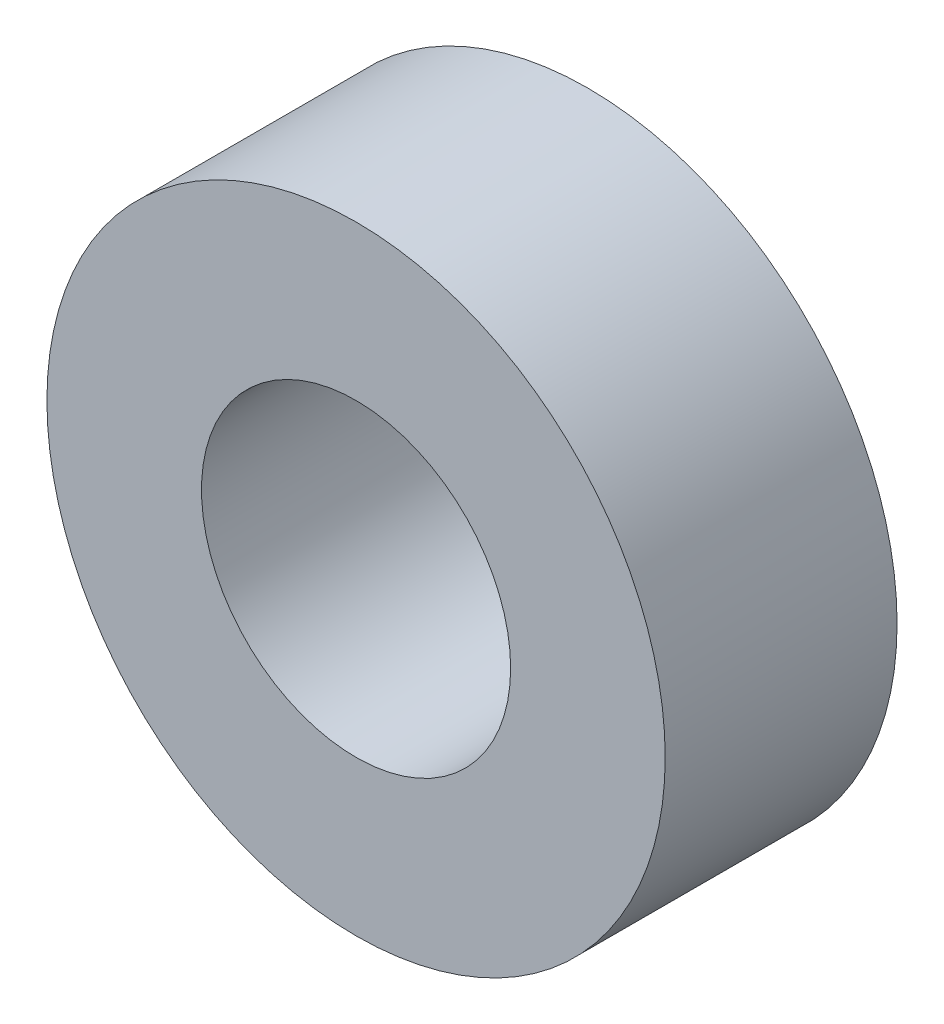
ISO-10303-21;
HEADER;
FILE_DESCRIPTION(('STEP AP214'),'2;1');
FILE_NAME('part.step','',(''),(''),'','','');
FILE_SCHEMA(('AUTOMOTIVE_DESIGN { 1 0 10303 214 1 1 1 1 }'));
ENDSEC;
DATA;
#1=APPLICATION_CONTEXT('core data for automotive mechanical design processes');
#2=APPLICATION_PROTOCOL_DEFINITION('international standard','automotive_design',2000,#1);
#3=PRODUCT_CONTEXT('',#1,'mechanical');
#4=PRODUCT('Part','Part','',(#3));
#5=PRODUCT_RELATED_PRODUCT_CATEGORY('part','',(#4));
#6=PRODUCT_DEFINITION_FORMATION('','',#4);
#7=PRODUCT_DEFINITION_CONTEXT('part definition',#1,'design');
#8=PRODUCT_DEFINITION('design','',#6,#7);
#9=PRODUCT_DEFINITION_SHAPE('','',#8);
#10=(LENGTH_UNIT() NAMED_UNIT(*) SI_UNIT(.MILLI.,.METRE.));
#11=(NAMED_UNIT(*) PLANE_ANGLE_UNIT() SI_UNIT($,.RADIAN.));
#12=(NAMED_UNIT(*) SI_UNIT($,.STERADIAN.) SOLID_ANGLE_UNIT());
#13=UNCERTAINTY_MEASURE_WITH_UNIT(LENGTH_MEASURE(1.E-05),#10,'distance_accuracy_value','');
#14=(GEOMETRIC_REPRESENTATION_CONTEXT(3) GLOBAL_UNCERTAINTY_ASSIGNED_CONTEXT((#13)) GLOBAL_UNIT_ASSIGNED_CONTEXT((#10,
#11,#12)) REPRESENTATION_CONTEXT('',''));
#15=CARTESIAN_POINT('',(0.,0.,0.));
#16=DIRECTION('',(0.,0.,1.));
#17=DIRECTION('',(1.,0.,0.));
#18=AXIS2_PLACEMENT_3D('',#15,#16,#17);
#19=CARTESIAN_POINT('',(0.,0.,4.7625));
#20=DIRECTION('',(0.,0.,-1.));
#21=DIRECTION('',(-1.,0.,0.));
#22=AXIS2_PLACEMENT_3D('',#19,#20,#21);
#23=CYLINDRICAL_SURFACE('',#22,6.35);
#24=CARTESIAN_POINT('',(0.,0.,4.7625));
#25=DIRECTION('',(0.,0.,1.));
#26=DIRECTION('',(1.,0.,0.));
#27=AXIS2_PLACEMENT_3D('',#24,#25,#26);
#28=CIRCLE('',#27,6.35);
#29=CARTESIAN_POINT('',(-6.35,0.,4.7625));
#30=VERTEX_POINT('',#29);
#31=EDGE_CURVE('E10',#30,#30,#28,.T.);
#32=CARTESIAN_POINT('',(0.,0.,0.));
#33=DIRECTION('',(0.,0.,1.));
#34=DIRECTION('',(1.,0.,0.));
#35=AXIS2_PLACEMENT_3D('',#32,#33,#34);
#36=CIRCLE('',#35,6.35);
#37=CARTESIAN_POINT('',(-6.35,0.,0.));
#38=VERTEX_POINT('',#37);
#39=EDGE_CURVE('E42',#38,#38,#36,.T.);
#40=CARTESIAN_POINT('',(-6.35,0.,4.7625));
#41=CARTESIAN_POINT('',(-6.35,0.,4.712890625));
#42=CARTESIAN_POINT('',(-6.35,0.,4.66328125));
#43=CARTESIAN_POINT('',(-6.35,0.,4.5640625));
#44=CARTESIAN_POINT('',(-6.35,0.,4.514453125));
#45=CARTESIAN_POINT('',(-6.35,0.,4.415234375));
#46=CARTESIAN_POINT('',(-6.35,0.,4.365625));
#47=CARTESIAN_POINT('',(-6.35,0.,4.26640625));
#48=CARTESIAN_POINT('',(-6.35,0.,4.216796875));
#49=CARTESIAN_POINT('',(-6.35,0.,4.117578125));
#50=CARTESIAN_POINT('',(-6.35,0.,4.06796875));
#51=CARTESIAN_POINT('',(-6.35,0.,3.96875));
#52=CARTESIAN_POINT('',(-6.35,0.,3.919140625));
#53=CARTESIAN_POINT('',(-6.35,0.,3.819921875));
#54=CARTESIAN_POINT('',(-6.35,0.,3.7703125));
#55=CARTESIAN_POINT('',(-6.35,0.,3.67109375));
#56=CARTESIAN_POINT('',(-6.35,0.,3.621484375));
#57=CARTESIAN_POINT('',(-6.35,0.,3.522265625));
#58=CARTESIAN_POINT('',(-6.35,0.,3.47265625));
#59=CARTESIAN_POINT('',(-6.35,0.,3.3734375));
#60=CARTESIAN_POINT('',(-6.35,0.,3.323828125));
#61=CARTESIAN_POINT('',(-6.35,0.,3.224609375));
#62=CARTESIAN_POINT('',(-6.35,0.,3.175));
#63=CARTESIAN_POINT('',(-6.35,0.,3.07578125));
#64=CARTESIAN_POINT('',(-6.35,0.,3.026171875));
#65=CARTESIAN_POINT('',(-6.35,0.,2.926953125));
#66=CARTESIAN_POINT('',(-6.35,0.,2.87734375));
#67=CARTESIAN_POINT('',(-6.35,0.,2.778125));
#68=CARTESIAN_POINT('',(-6.35,0.,2.728515625));
#69=CARTESIAN_POINT('',(-6.35,0.,2.629296875));
#70=CARTESIAN_POINT('',(-6.35,0.,2.5796875));
#71=CARTESIAN_POINT('',(-6.35,0.,2.48046875));
#72=CARTESIAN_POINT('',(-6.35,0.,2.430859375));
#73=CARTESIAN_POINT('',(-6.35,0.,2.331640625));
#74=CARTESIAN_POINT('',(-6.35,0.,2.28203125));
#75=CARTESIAN_POINT('',(-6.35,0.,2.1828125));
#76=CARTESIAN_POINT('',(-6.35,0.,2.133203125));
#77=CARTESIAN_POINT('',(-6.35,0.,2.033984375));
#78=CARTESIAN_POINT('',(-6.35,0.,1.984375));
#79=CARTESIAN_POINT('',(-6.35,0.,1.88515625));
#80=CARTESIAN_POINT('',(-6.35,0.,1.835546875));
#81=CARTESIAN_POINT('',(-6.35,0.,1.736328125));
#82=CARTESIAN_POINT('',(-6.35,0.,1.68671875));
#83=CARTESIAN_POINT('',(-6.35,0.,1.5875));
#84=CARTESIAN_POINT('',(-6.35,0.,1.537890625));
#85=CARTESIAN_POINT('',(-6.35,0.,1.438671875));
#86=CARTESIAN_POINT('',(-6.35,0.,1.3890625));
#87=CARTESIAN_POINT('',(-6.35,0.,1.28984375));
#88=CARTESIAN_POINT('',(-6.35,0.,1.240234375));
#89=CARTESIAN_POINT('',(-6.35,0.,1.141015625));
#90=CARTESIAN_POINT('',(-6.35,0.,1.09140625));
#91=CARTESIAN_POINT('',(-6.35,0.,0.992187499999999));
#92=CARTESIAN_POINT('',(-6.35,0.,0.942578124999999));
#93=CARTESIAN_POINT('',(-6.35,0.,0.843359375));
#94=CARTESIAN_POINT('',(-6.35,0.,0.79375));
#95=CARTESIAN_POINT('',(-6.35,0.,0.69453125));
#96=CARTESIAN_POINT('',(-6.35,0.,0.644921875));
#97=CARTESIAN_POINT('',(-6.35,0.,0.545703125));
#98=CARTESIAN_POINT('',(-6.35,0.,0.49609375));
#99=CARTESIAN_POINT('',(-6.35,0.,0.396875));
#100=CARTESIAN_POINT('',(-6.35,0.,0.347265625));
#101=CARTESIAN_POINT('',(-6.35,0.,0.248046875));
#102=CARTESIAN_POINT('',(-6.35,0.,0.1984375));
#103=CARTESIAN_POINT('',(-6.35,0.,0.09921875));
#104=CARTESIAN_POINT('',(-6.35,0.,0.049609375));
#105=CARTESIAN_POINT('',(-6.35,0.,0.));
#106=B_SPLINE_CURVE_WITH_KNOTS('',3,(#40,#41,#42,#43,#44,#45,#46,#47,#48,#49,#50,#51,#52,#53,
#54,#55,#56,#57,#58,#59,#60,#61,#62,#63,#64,#65,#66,#67,#68,#69,#70,#71,#72,#73,#74,#75,#76,#77,
#78,#79,#80,#81,#82,#83,#84,#85,#86,#87,#88,#89,#90,#91,#92,#93,#94,#95,#96,#97,#98,#99,#100,
#101,#102,#103,#104,#105),.UNSPECIFIED.,.F.,.F.,(4,2,2,2,2,2,2,2,2,2,2,2,2,2,2,2,2,2,2,2,2,2,2,
2,2,2,2,2,2,2,2,2,4),(0.,0.148828125,0.29765625,0.446484375,0.5953125,0.744140625,
0.892968750000001,1.041796875,1.190625,1.339453125,1.48828125,1.637109375,1.7859375,1.934765625,
2.08359375,2.232421875,2.38125,2.530078125,2.67890625,2.827734375,2.9765625,3.125390625,
3.27421875,3.423046875,3.571875,3.720703125,3.86953125,4.018359375,4.1671875,4.316015625,
4.46484375,4.613671875,4.7625),.UNSPECIFIED.);
#107=EDGE_CURVE('BSEAM39',#30,#38,#106,.T.);
#108=ORIENTED_EDGE('',*,*,#31,.F.);
#109=ORIENTED_EDGE('',*,*,#39,.T.);
#110=ORIENTED_EDGE('',*,*,#107,.T.);
#111=ORIENTED_EDGE('',*,*,#107,.F.);
#112=EDGE_LOOP('',(#108,#110,#109,#111));
#113=FACE_BOUND('',#112,.T.);
#114=ADVANCED_FACE('F39',(#113),#23,.T.);
#115=CARTESIAN_POINT('',(0.,0.,4.7625));
#116=DIRECTION('',(0.,0.,1.));
#117=DIRECTION('',(1.,0.,0.));
#118=AXIS2_PLACEMENT_3D('',#115,#116,#117);
#119=PLANE('',#118);
#120=CARTESIAN_POINT('',(0.,0.,4.7625));
#121=DIRECTION('',(0.,0.,1.));
#122=DIRECTION('',(1.,0.,0.));
#123=AXIS2_PLACEMENT_3D('',#120,#121,#122);
#124=CIRCLE('',#123,3.175);
#125=CARTESIAN_POINT('',(3.175,0.,4.7625));
#126=VERTEX_POINT('',#125);
#127=EDGE_CURVE('E51',#126,#126,#124,.T.);
#128=ORIENTED_EDGE('',*,*,#127,.F.);
#129=EDGE_LOOP('',(#128));
#130=FACE_BOUND('',#129,.T.);
#131=ORIENTED_EDGE('',*,*,#31,.T.);
#132=EDGE_LOOP('',(#131));
#133=FACE_BOUND('',#132,.T.);
#134=ADVANCED_FACE('F71',(#130,#133),#119,.T.);
#135=CARTESIAN_POINT('',(0.,0.,0.));
#136=DIRECTION('',(0.,0.,1.));
#137=DIRECTION('',(1.,0.,0.));
#138=AXIS2_PLACEMENT_3D('',#135,#136,#137);
#139=PLANE('',#138);
#140=CARTESIAN_POINT('',(0.,0.,0.));
#141=DIRECTION('',(0.,0.,1.));
#142=DIRECTION('',(1.,0.,0.));
#143=AXIS2_PLACEMENT_3D('',#140,#141,#142);
#144=CIRCLE('',#143,3.175);
#145=CARTESIAN_POINT('',(3.175,0.,0.));
#146=VERTEX_POINT('',#145);
#147=EDGE_CURVE('E56',#146,#146,#144,.T.);
#148=ORIENTED_EDGE('',*,*,#147,.T.);
#149=EDGE_LOOP('',(#148));
#150=FACE_BOUND('',#149,.T.);
#151=ORIENTED_EDGE('',*,*,#39,.F.);
#152=EDGE_LOOP('',(#151));
#153=FACE_BOUND('',#152,.T.);
#154=ADVANCED_FACE('F61',(#150,#153),#139,.F.);
#155=CARTESIAN_POINT('',(0.,0.,0.));
#156=DIRECTION('',(0.,0.,1.));
#157=DIRECTION('',(1.,0.,0.));
#158=AXIS2_PLACEMENT_3D('',#155,#156,#157);
#159=CYLINDRICAL_SURFACE('',#158,3.175);
#160=CARTESIAN_POINT('',(3.175,0.,4.7625));
#161=CARTESIAN_POINT('',(3.175,0.,4.712890625));
#162=CARTESIAN_POINT('',(3.175,0.,4.66328125));
#163=CARTESIAN_POINT('',(3.175,0.,4.5640625));
#164=CARTESIAN_POINT('',(3.175,0.,4.514453125));
#165=CARTESIAN_POINT('',(3.175,0.,4.415234375));
#166=CARTESIAN_POINT('',(3.175,0.,4.365625));
#167=CARTESIAN_POINT('',(3.175,0.,4.26640625));
#168=CARTESIAN_POINT('',(3.175,0.,4.216796875));
#169=CARTESIAN_POINT('',(3.175,0.,4.117578125));
#170=CARTESIAN_POINT('',(3.175,0.,4.06796875));
#171=CARTESIAN_POINT('',(3.175,0.,3.96875));
#172=CARTESIAN_POINT('',(3.175,0.,3.919140625));
#173=CARTESIAN_POINT('',(3.175,0.,3.819921875));
#174=CARTESIAN_POINT('',(3.175,0.,3.7703125));
#175=CARTESIAN_POINT('',(3.175,0.,3.67109375));
#176=CARTESIAN_POINT('',(3.175,0.,3.621484375));
#177=CARTESIAN_POINT('',(3.175,0.,3.522265625));
#178=CARTESIAN_POINT('',(3.175,0.,3.47265625));
#179=CARTESIAN_POINT('',(3.175,0.,3.3734375));
#180=CARTESIAN_POINT('',(3.175,0.,3.323828125));
#181=CARTESIAN_POINT('',(3.175,0.,3.224609375));
#182=CARTESIAN_POINT('',(3.175,0.,3.175));
#183=CARTESIAN_POINT('',(3.175,0.,3.07578125));
#184=CARTESIAN_POINT('',(3.175,0.,3.026171875));
#185=CARTESIAN_POINT('',(3.175,0.,2.926953125));
#186=CARTESIAN_POINT('',(3.175,0.,2.87734375));
#187=CARTESIAN_POINT('',(3.175,0.,2.778125));
#188=CARTESIAN_POINT('',(3.175,0.,2.728515625));
#189=CARTESIAN_POINT('',(3.175,0.,2.629296875));
#190=CARTESIAN_POINT('',(3.175,0.,2.5796875));
#191=CARTESIAN_POINT('',(3.175,0.,2.48046875));
#192=CARTESIAN_POINT('',(3.175,0.,2.430859375));
#193=CARTESIAN_POINT('',(3.175,0.,2.331640625));
#194=CARTESIAN_POINT('',(3.175,0.,2.28203125));
#195=CARTESIAN_POINT('',(3.175,0.,2.1828125));
#196=CARTESIAN_POINT('',(3.175,0.,2.133203125));
#197=CARTESIAN_POINT('',(3.175,0.,2.033984375));
#198=CARTESIAN_POINT('',(3.175,0.,1.984375));
#199=CARTESIAN_POINT('',(3.175,0.,1.88515625));
#200=CARTESIAN_POINT('',(3.175,0.,1.835546875));
#201=CARTESIAN_POINT('',(3.175,0.,1.736328125));
#202=CARTESIAN_POINT('',(3.175,0.,1.68671875));
#203=CARTESIAN_POINT('',(3.175,0.,1.5875));
#204=CARTESIAN_POINT('',(3.175,0.,1.537890625));
#205=CARTESIAN_POINT('',(3.175,0.,1.438671875));
#206=CARTESIAN_POINT('',(3.175,0.,1.3890625));
#207=CARTESIAN_POINT('',(3.175,0.,1.28984375));
#208=CARTESIAN_POINT('',(3.175,0.,1.240234375));
#209=CARTESIAN_POINT('',(3.175,0.,1.141015625));
#210=CARTESIAN_POINT('',(3.175,0.,1.09140625));
#211=CARTESIAN_POINT('',(3.175,0.,0.9921875));
#212=CARTESIAN_POINT('',(3.175,0.,0.942578125));
#213=CARTESIAN_POINT('',(3.175,0.,0.843359375));
#214=CARTESIAN_POINT('',(3.175,0.,0.79375));
#215=CARTESIAN_POINT('',(3.175,0.,0.69453125));
#216=CARTESIAN_POINT('',(3.175,0.,0.644921875));
#217=CARTESIAN_POINT('',(3.175,0.,0.545703125));
#218=CARTESIAN_POINT('',(3.175,0.,0.49609375));
#219=CARTESIAN_POINT('',(3.175,0.,0.396875));
#220=CARTESIAN_POINT('',(3.175,0.,0.347265625));
#221=CARTESIAN_POINT('',(3.175,0.,0.248046875));
#222=CARTESIAN_POINT('',(3.175,0.,0.1984375));
#223=CARTESIAN_POINT('',(3.175,0.,0.0992187500000001));
#224=CARTESIAN_POINT('',(3.175,0.,0.0496093750000001));
#225=CARTESIAN_POINT('',(3.175,0.,0.));
#226=B_SPLINE_CURVE_WITH_KNOTS('',3,(#160,#161,#162,#163,#164,#165,#166,#167,#168,#169,#170,
#171,#172,#173,#174,#175,#176,#177,#178,#179,#180,#181,#182,#183,#184,#185,#186,#187,#188,#189,
#190,#191,#192,#193,#194,#195,#196,#197,#198,#199,#200,#201,#202,#203,#204,#205,#206,#207,#208,
#209,#210,#211,#212,#213,#214,#215,#216,#217,#218,#219,#220,#221,#222,#223,#224,#225),
.UNSPECIFIED.,.F.,.F.,(4,2,2,2,2,2,2,2,2,2,2,2,2,2,2,2,2,2,2,2,2,2,2,2,2,2,2,2,2,2,2,2,4),(0.,
0.148828125,0.29765625,0.446484375,0.5953125,0.744140625,0.89296875,1.041796875,1.190625,
1.339453125,1.48828125,1.637109375,1.7859375,1.934765625,2.08359375,2.232421875,2.38125,
2.530078125,2.67890625,2.827734375,2.9765625,3.125390625,3.27421875,3.423046875,3.571875,
3.720703125,3.86953125,4.018359375,4.1671875,4.316015625,4.46484375,4.613671875,4.7625),.UNSPECIFIED.);
#227=EDGE_CURVE('BSEAM64',#126,#146,#226,.T.);
#228=ORIENTED_EDGE('',*,*,#127,.T.);
#229=ORIENTED_EDGE('',*,*,#147,.F.);
#230=ORIENTED_EDGE('',*,*,#227,.T.);
#231=ORIENTED_EDGE('',*,*,#227,.F.);
#232=EDGE_LOOP('',(#228,#230,#229,#231));
#233=FACE_BOUND('',#232,.T.);
#234=ADVANCED_FACE('F64',(#233),#159,.F.);
#235=CLOSED_SHELL('',(#114,#134,#154,#234));
#236=MANIFOLD_SOLID_BREP('B2',#235);
#237=ADVANCED_BREP_SHAPE_REPRESENTATION('',(#18,#236),#14);
#238=SHAPE_DEFINITION_REPRESENTATION(#9,#237);
ENDSEC;
END-ISO-10303-21;
